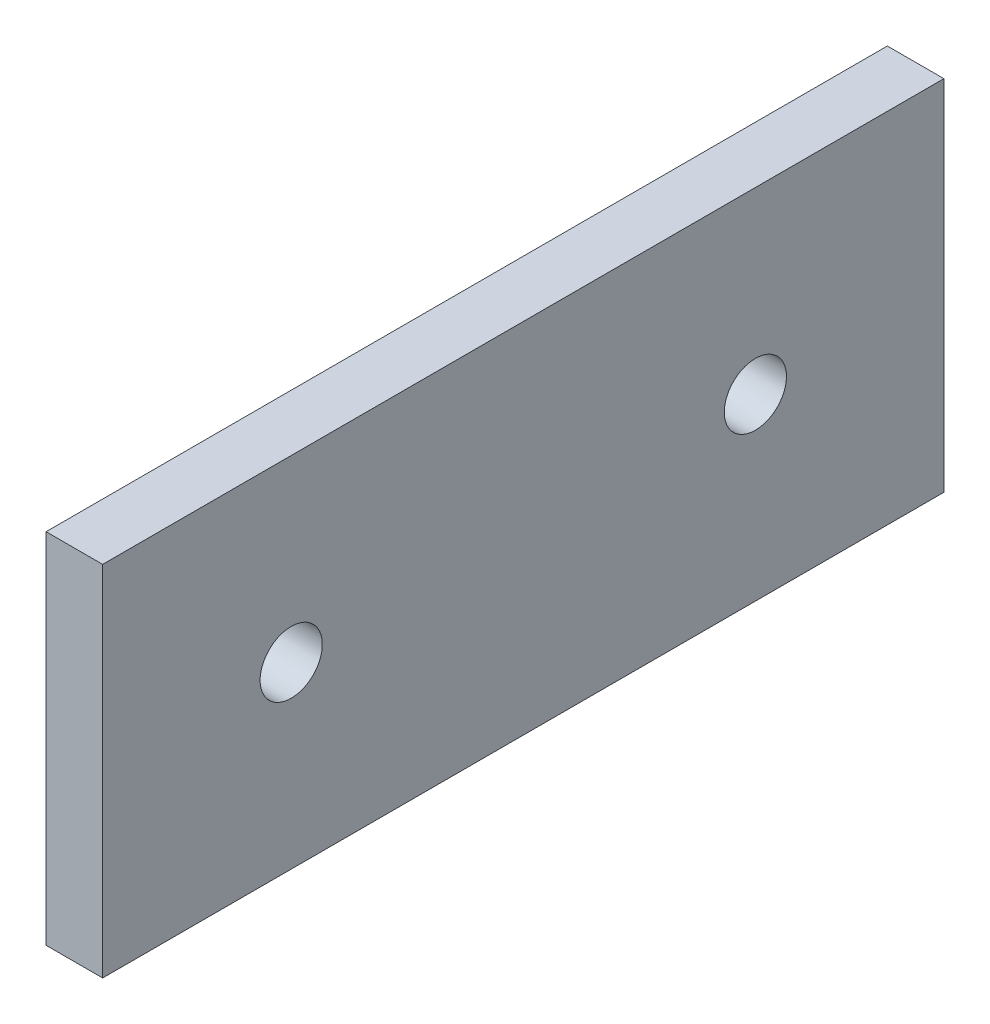
ISO-10303-21;
HEADER;
FILE_DESCRIPTION(('STEP AP214'),'2;1');
FILE_NAME('part.step','',(''),(''),'','','');
FILE_SCHEMA(('AUTOMOTIVE_DESIGN { 1 0 10303 214 1 1 1 1 }'));
ENDSEC;
DATA;
#1=APPLICATION_CONTEXT('core data for automotive mechanical design processes');
#2=APPLICATION_PROTOCOL_DEFINITION('international standard','automotive_design',2000,#1);
#3=PRODUCT_CONTEXT('',#1,'mechanical');
#4=PRODUCT('Part','Part','',(#3));
#5=PRODUCT_RELATED_PRODUCT_CATEGORY('part','',(#4));
#6=PRODUCT_DEFINITION_FORMATION('','',#4);
#7=PRODUCT_DEFINITION_CONTEXT('part definition',#1,'design');
#8=PRODUCT_DEFINITION('design','',#6,#7);
#9=PRODUCT_DEFINITION_SHAPE('','',#8);
#10=(LENGTH_UNIT() NAMED_UNIT(*) SI_UNIT(.MILLI.,.METRE.));
#11=(NAMED_UNIT(*) PLANE_ANGLE_UNIT() SI_UNIT($,.RADIAN.));
#12=(NAMED_UNIT(*) SI_UNIT($,.STERADIAN.) SOLID_ANGLE_UNIT());
#13=UNCERTAINTY_MEASURE_WITH_UNIT(LENGTH_MEASURE(1.E-05),#10,'distance_accuracy_value','');
#14=(GEOMETRIC_REPRESENTATION_CONTEXT(3) GLOBAL_UNCERTAINTY_ASSIGNED_CONTEXT((#13)) GLOBAL_UNIT_ASSIGNED_CONTEXT((#10,
#11,#12)) REPRESENTATION_CONTEXT('',''));
#15=CARTESIAN_POINT('',(0.,0.,0.));
#16=DIRECTION('',(0.,0.,1.));
#17=DIRECTION('',(1.,0.,0.));
#18=AXIS2_PLACEMENT_3D('',#15,#16,#17);
#19=CARTESIAN_POINT('',(0.,0.,44.62));
#20=DIRECTION('',(0.,0.,1.));
#21=DIRECTION('',(1.,0.,0.));
#22=AXIS2_PLACEMENT_3D('',#19,#20,#21);
#23=PLANE('',#22);
#24=DIRECTION('',(1.,0.,0.));
#25=VECTOR('',#24,1.);
#26=CARTESIAN_POINT('',(0.,-3.,44.62));
#27=LINE('',#26,#25);
#28=CARTESIAN_POINT('',(-3.,-3.,44.62));
#29=VERTEX_POINT('',#28);
#30=CARTESIAN_POINT('',(0.,-3.,44.62));
#31=VERTEX_POINT('',#30);
#32=EDGE_CURVE('E114',#29,#31,#27,.T.);
#33=ORIENTED_EDGE('',*,*,#32,.T.);
#34=DIRECTION('',(0.,-1.,0.));
#35=VECTOR('',#34,1.);
#36=CARTESIAN_POINT('',(0.,0.,44.62));
#37=LINE('',#36,#35);
#38=CARTESIAN_POINT('',(0.,16.,44.62));
#39=VERTEX_POINT('',#38);
#40=EDGE_CURVE('E94',#39,#31,#37,.T.);
#41=ORIENTED_EDGE('',*,*,#40,.F.);
#42=DIRECTION('',(-1.,0.,0.));
#43=VECTOR('',#42,1.);
#44=CARTESIAN_POINT('',(0.,16.,44.62));
#45=LINE('',#44,#43);
#46=CARTESIAN_POINT('',(-3.,16.,44.62));
#47=VERTEX_POINT('',#46);
#48=EDGE_CURVE('E77',#39,#47,#45,.T.);
#49=ORIENTED_EDGE('',*,*,#48,.T.);
#50=DIRECTION('',(0.,-1.,0.));
#51=VECTOR('',#50,1.);
#52=CARTESIAN_POINT('',(-3.,0.,44.62));
#53=LINE('',#52,#51);
#54=EDGE_CURVE('E117',#47,#29,#53,.T.);
#55=ORIENTED_EDGE('',*,*,#54,.T.);
#56=EDGE_LOOP('',(#33,#41,#49,#55));
#57=FACE_BOUND('',#56,.T.);
#58=ADVANCED_FACE('F60',(#57),#23,.T.);
#59=CARTESIAN_POINT('',(0.,0.,0.));
#60=DIRECTION('',(0.,0.,1.));
#61=DIRECTION('',(1.,0.,0.));
#62=AXIS2_PLACEMENT_3D('',#59,#60,#61);
#63=PLANE('',#62);
#64=DIRECTION('',(0.,-1.,0.));
#65=VECTOR('',#64,1.);
#66=CARTESIAN_POINT('',(0.,0.,0.));
#67=LINE('',#66,#65);
#68=CARTESIAN_POINT('',(0.,16.,0.));
#69=VERTEX_POINT('',#68);
#70=CARTESIAN_POINT('',(0.,-3.,0.));
#71=VERTEX_POINT('',#70);
#72=EDGE_CURVE('E110',#69,#71,#67,.T.);
#73=ORIENTED_EDGE('',*,*,#72,.T.);
#74=DIRECTION('',(1.,0.,0.));
#75=VECTOR('',#74,1.);
#76=CARTESIAN_POINT('',(0.,-3.,0.));
#77=LINE('',#76,#75);
#78=CARTESIAN_POINT('',(-3.,-3.,0.));
#79=VERTEX_POINT('',#78);
#80=EDGE_CURVE('E89',#79,#71,#77,.T.);
#81=ORIENTED_EDGE('',*,*,#80,.F.);
#82=DIRECTION('',(0.,-1.,0.));
#83=VECTOR('',#82,1.);
#84=CARTESIAN_POINT('',(-3.,0.,0.));
#85=LINE('',#84,#83);
#86=CARTESIAN_POINT('',(-3.,16.,0.));
#87=VERTEX_POINT('',#86);
#88=EDGE_CURVE('E109',#87,#79,#85,.T.);
#89=ORIENTED_EDGE('',*,*,#88,.F.);
#90=DIRECTION('',(-1.,0.,0.));
#91=VECTOR('',#90,1.);
#92=CARTESIAN_POINT('',(0.,16.,0.));
#93=LINE('',#92,#91);
#94=EDGE_CURVE('E121',#69,#87,#93,.T.);
#95=ORIENTED_EDGE('',*,*,#94,.F.);
#96=EDGE_LOOP('',(#73,#81,#89,#95));
#97=FACE_BOUND('',#96,.T.);
#98=ADVANCED_FACE('F132',(#97),#63,.F.);
#99=CARTESIAN_POINT('',(0.,-3.,44.62));
#100=DIRECTION('',(0.,1.,0.));
#101=DIRECTION('',(0.,0.,1.));
#102=AXIS2_PLACEMENT_3D('',#99,#100,#101);
#103=PLANE('',#102);
#104=DIRECTION('',(0.,0.,-1.));
#105=VECTOR('',#104,1.);
#106=CARTESIAN_POINT('',(0.,-3.,44.62));
#107=LINE('',#106,#105);
#108=EDGE_CURVE('E106',#31,#71,#107,.T.);
#109=ORIENTED_EDGE('',*,*,#108,.F.);
#110=ORIENTED_EDGE('',*,*,#32,.F.);
#111=DIRECTION('',(0.,0.,-1.));
#112=VECTOR('',#111,1.);
#113=CARTESIAN_POINT('',(-3.,-3.,44.62));
#114=LINE('',#113,#112);
#115=EDGE_CURVE('E12',#29,#79,#114,.T.);
#116=ORIENTED_EDGE('',*,*,#115,.T.);
#117=ORIENTED_EDGE('',*,*,#80,.T.);
#118=EDGE_LOOP('',(#109,#110,#116,#117));
#119=FACE_BOUND('',#118,.T.);
#120=ADVANCED_FACE('F113',(#119),#103,.F.);
#121=CARTESIAN_POINT('',(0.,16.,44.62));
#122=DIRECTION('',(0.,-1.,0.));
#123=DIRECTION('',(0.,0.,-1.));
#124=AXIS2_PLACEMENT_3D('',#121,#122,#123);
#125=PLANE('',#124);
#126=DIRECTION('',(0.,0.,1.));
#127=VECTOR('',#126,1.);
#128=CARTESIAN_POINT('',(0.,16.,44.62));
#129=LINE('',#128,#127);
#130=EDGE_CURVE('E108',#69,#39,#129,.T.);
#131=ORIENTED_EDGE('',*,*,#130,.F.);
#132=ORIENTED_EDGE('',*,*,#94,.T.);
#133=DIRECTION('',(0.,0.,-1.));
#134=VECTOR('',#133,1.);
#135=CARTESIAN_POINT('',(-3.,16.,44.62));
#136=LINE('',#135,#134);
#137=EDGE_CURVE('E69',#47,#87,#136,.T.);
#138=ORIENTED_EDGE('',*,*,#137,.F.);
#139=ORIENTED_EDGE('',*,*,#48,.F.);
#140=EDGE_LOOP('',(#131,#132,#138,#139));
#141=FACE_BOUND('',#140,.T.);
#142=ADVANCED_FACE('F133',(#141),#125,.F.);
#143=CARTESIAN_POINT('',(-3.,0.,44.62));
#144=DIRECTION('',(1.,0.,0.));
#145=DIRECTION('',(0.,0.,-1.));
#146=AXIS2_PLACEMENT_3D('',#143,#144,#145);
#147=PLANE('',#146);
#148=CARTESIAN_POINT('',(-3.,6.5,10.));
#149=DIRECTION('',(-1.,0.,0.));
#150=DIRECTION('',(0.,0.,1.));
#151=AXIS2_PLACEMENT_3D('',#148,#149,#150);
#152=CIRCLE('',#151,1.65);
#153=CARTESIAN_POINT('',(-3.,6.5,11.65));
#154=VERTEX_POINT('',#153);
#155=EDGE_CURVE('E137',#154,#154,#152,.T.);
#156=ORIENTED_EDGE('',*,*,#155,.F.);
#157=EDGE_LOOP('',(#156));
#158=FACE_BOUND('',#157,.T.);
#159=CARTESIAN_POINT('',(-3.,6.5,34.62));
#160=DIRECTION('',(-1.,0.,0.));
#161=DIRECTION('',(0.,0.,1.));
#162=AXIS2_PLACEMENT_3D('',#159,#160,#161);
#163=CIRCLE('',#162,1.64999999999999);
#164=CARTESIAN_POINT('',(-3.,6.5,36.27));
#165=VERTEX_POINT('',#164);
#166=EDGE_CURVE('E134',#165,#165,#163,.T.);
#167=ORIENTED_EDGE('',*,*,#166,.F.);
#168=EDGE_LOOP('',(#167));
#169=FACE_BOUND('',#168,.T.);
#170=ORIENTED_EDGE('',*,*,#88,.T.);
#171=ORIENTED_EDGE('',*,*,#115,.F.);
#172=ORIENTED_EDGE('',*,*,#54,.F.);
#173=ORIENTED_EDGE('',*,*,#137,.T.);
#174=EDGE_LOOP('',(#170,#171,#172,#173));
#175=FACE_BOUND('',#174,.T.);
#176=ADVANCED_FACE('F62',(#158,#169,#175),#147,.F.);
#177=CARTESIAN_POINT('',(0.,0.,44.62));
#178=DIRECTION('',(1.,0.,0.));
#179=DIRECTION('',(0.,0.,-1.));
#180=AXIS2_PLACEMENT_3D('',#177,#178,#179);
#181=PLANE('',#180);
#182=CARTESIAN_POINT('',(0.,6.5,10.));
#183=DIRECTION('',(1.,0.,0.));
#184=DIRECTION('',(0.,0.,-1.));
#185=AXIS2_PLACEMENT_3D('',#182,#183,#184);
#186=CIRCLE('',#185,1.65);
#187=CARTESIAN_POINT('',(0.,6.5,11.65));
#188=VERTEX_POINT('',#187);
#189=EDGE_CURVE('E145',#188,#188,#186,.T.);
#190=ORIENTED_EDGE('',*,*,#189,.F.);
#191=EDGE_LOOP('',(#190));
#192=FACE_BOUND('',#191,.T.);
#193=CARTESIAN_POINT('',(0.,6.5,34.62));
#194=DIRECTION('',(1.,0.,0.));
#195=DIRECTION('',(0.,0.,-1.));
#196=AXIS2_PLACEMENT_3D('',#193,#194,#195);
#197=CIRCLE('',#196,1.64999999999999);
#198=CARTESIAN_POINT('',(0.,6.5,36.27));
#199=VERTEX_POINT('',#198);
#200=EDGE_CURVE('E141',#199,#199,#197,.T.);
#201=ORIENTED_EDGE('',*,*,#200,.F.);
#202=EDGE_LOOP('',(#201));
#203=FACE_BOUND('',#202,.T.);
#204=ORIENTED_EDGE('',*,*,#72,.F.);
#205=ORIENTED_EDGE('',*,*,#130,.T.);
#206=ORIENTED_EDGE('',*,*,#40,.T.);
#207=ORIENTED_EDGE('',*,*,#108,.T.);
#208=EDGE_LOOP('',(#204,#205,#206,#207));
#209=FACE_BOUND('',#208,.T.);
#210=ADVANCED_FACE('F105',(#192,#203,#209),#181,.T.);
#211=CARTESIAN_POINT('',(27.,6.5,34.62));
#212=DIRECTION('',(-1.,0.,0.));
#213=DIRECTION('',(0.,0.,1.));
#214=AXIS2_PLACEMENT_3D('',#211,#212,#213);
#215=CYLINDRICAL_SURFACE('',#214,1.64999999999999);
#216=CARTESIAN_POINT('',(0.,6.5,36.27));
#217=CARTESIAN_POINT('',(-0.0312500000000035,6.5,36.27));
#218=CARTESIAN_POINT('',(-0.0625000000000035,6.5,36.27));
#219=CARTESIAN_POINT('',(-0.125000000000004,6.5,36.27));
#220=CARTESIAN_POINT('',(-0.156250000000004,6.5,36.27));
#221=CARTESIAN_POINT('',(-0.218750000000004,6.5,36.27));
#222=CARTESIAN_POINT('',(-0.250000000000004,6.5,36.27));
#223=CARTESIAN_POINT('',(-0.312500000000004,6.5,36.27));
#224=CARTESIAN_POINT('',(-0.343750000000004,6.5,36.27));
#225=CARTESIAN_POINT('',(-0.406250000000004,6.5,36.27));
#226=CARTESIAN_POINT('',(-0.437500000000004,6.5,36.27));
#227=CARTESIAN_POINT('',(-0.500000000000004,6.5,36.27));
#228=CARTESIAN_POINT('',(-0.531250000000004,6.5,36.27));
#229=CARTESIAN_POINT('',(-0.593750000000004,6.5,36.27));
#230=CARTESIAN_POINT('',(-0.625000000000004,6.5,36.27));
#231=CARTESIAN_POINT('',(-0.687500000000004,6.5,36.27));
#232=CARTESIAN_POINT('',(-0.718750000000004,6.5,36.27));
#233=CARTESIAN_POINT('',(-0.781250000000003,6.5,36.27));
#234=CARTESIAN_POINT('',(-0.812500000000002,6.5,36.27));
#235=CARTESIAN_POINT('',(-0.875000000000001,6.5,36.27));
#236=CARTESIAN_POINT('',(-0.906250000000001,6.5,36.27));
#237=CARTESIAN_POINT('',(-0.968750000000001,6.5,36.27));
#238=CARTESIAN_POINT('',(-1.,6.5,36.27));
#239=CARTESIAN_POINT('',(-1.0625,6.5,36.27));
#240=CARTESIAN_POINT('',(-1.09375,6.5,36.27));
#241=CARTESIAN_POINT('',(-1.15625,6.5,36.27));
#242=CARTESIAN_POINT('',(-1.1875,6.5,36.27));
#243=CARTESIAN_POINT('',(-1.25,6.5,36.27));
#244=CARTESIAN_POINT('',(-1.28125,6.5,36.27));
#245=CARTESIAN_POINT('',(-1.34375,6.5,36.27));
#246=CARTESIAN_POINT('',(-1.375,6.5,36.27));
#247=CARTESIAN_POINT('',(-1.4375,6.5,36.27));
#248=CARTESIAN_POINT('',(-1.46875,6.5,36.27));
#249=CARTESIAN_POINT('',(-1.53125,6.5,36.27));
#250=CARTESIAN_POINT('',(-1.5625,6.5,36.27));
#251=CARTESIAN_POINT('',(-1.625,6.5,36.27));
#252=CARTESIAN_POINT('',(-1.65625,6.5,36.27));
#253=CARTESIAN_POINT('',(-1.71875,6.5,36.27));
#254=CARTESIAN_POINT('',(-1.75,6.5,36.27));
#255=CARTESIAN_POINT('',(-1.8125,6.5,36.27));
#256=CARTESIAN_POINT('',(-1.84375,6.5,36.27));
#257=CARTESIAN_POINT('',(-1.90625,6.5,36.27));
#258=CARTESIAN_POINT('',(-1.9375,6.5,36.27));
#259=CARTESIAN_POINT('',(-2.,6.5,36.27));
#260=CARTESIAN_POINT('',(-2.03125,6.5,36.27));
#261=CARTESIAN_POINT('',(-2.09375,6.5,36.27));
#262=CARTESIAN_POINT('',(-2.125,6.5,36.27));
#263=CARTESIAN_POINT('',(-2.1875,6.5,36.27));
#264=CARTESIAN_POINT('',(-2.21875,6.5,36.27));
#265=CARTESIAN_POINT('',(-2.28125,6.5,36.27));
#266=CARTESIAN_POINT('',(-2.3125,6.5,36.27));
#267=CARTESIAN_POINT('',(-2.375,6.5,36.27));
#268=CARTESIAN_POINT('',(-2.40625,6.5,36.27));
#269=CARTESIAN_POINT('',(-2.46875,6.5,36.27));
#270=CARTESIAN_POINT('',(-2.5,6.5,36.27));
#271=CARTESIAN_POINT('',(-2.5625,6.5,36.27));
#272=CARTESIAN_POINT('',(-2.59375,6.5,36.27));
#273=CARTESIAN_POINT('',(-2.65625,6.5,36.27));
#274=CARTESIAN_POINT('',(-2.6875,6.5,36.27));
#275=CARTESIAN_POINT('',(-2.75,6.5,36.27));
#276=CARTESIAN_POINT('',(-2.78125,6.5,36.27));
#277=CARTESIAN_POINT('',(-2.84375,6.5,36.27));
#278=CARTESIAN_POINT('',(-2.875,6.5,36.27));
#279=CARTESIAN_POINT('',(-2.9375,6.5,36.27));
#280=CARTESIAN_POINT('',(-2.96875,6.5,36.27));
#281=CARTESIAN_POINT('',(-3.,6.5,36.27));
#282=B_SPLINE_CURVE_WITH_KNOTS('',3,(#216,#217,#218,#219,#220,#221,#222,#223,#224,#225,#226,
#227,#228,#229,#230,#231,#232,#233,#234,#235,#236,#237,#238,#239,#240,#241,#242,#243,#244,#245,
#246,#247,#248,#249,#250,#251,#252,#253,#254,#255,#256,#257,#258,#259,#260,#261,#262,#263,#264,
#265,#266,#267,#268,#269,#270,#271,#272,#273,#274,#275,#276,#277,#278,#279,#280,#281),
.UNSPECIFIED.,.F.,.F.,(4,2,2,2,2,2,2,2,2,2,2,2,2,2,2,2,2,2,2,2,2,2,2,2,2,2,2,2,2,2,2,2,4),(0.,
0.0937500000000001,0.1875,0.28125,0.375,0.46875,0.5625,0.656250000000001,0.750000000000001,
0.843749999999997,0.937499999999997,1.03125,1.125,1.21875,1.3125,1.40625,1.5,1.59375,1.6875,
1.78125,1.875,1.96875,2.0625,2.15625,2.25,2.34375,2.4375,2.53125,2.625,2.71875,2.8125,2.90625,
3.),.UNSPECIFIED.);
#283=EDGE_CURVE('BSEAM154',#199,#165,#282,.T.);
#284=ORIENTED_EDGE('',*,*,#200,.T.);
#285=ORIENTED_EDGE('',*,*,#166,.T.);
#286=ORIENTED_EDGE('',*,*,#283,.T.);
#287=ORIENTED_EDGE('',*,*,#283,.F.);
#288=EDGE_LOOP('',(#284,#286,#285,#287));
#289=FACE_BOUND('',#288,.T.);
#290=ADVANCED_FACE('F154',(#289),#215,.F.);
#291=CARTESIAN_POINT('',(27.,6.5,10.));
#292=DIRECTION('',(-1.,0.,0.));
#293=DIRECTION('',(0.,0.,1.));
#294=AXIS2_PLACEMENT_3D('',#291,#292,#293);
#295=CYLINDRICAL_SURFACE('',#294,1.65);
#296=CARTESIAN_POINT('',(0.,6.5,11.65));
#297=CARTESIAN_POINT('',(-0.0312500000000035,6.5,11.65));
#298=CARTESIAN_POINT('',(-0.0625000000000035,6.5,11.65));
#299=CARTESIAN_POINT('',(-0.125000000000004,6.5,11.65));
#300=CARTESIAN_POINT('',(-0.156250000000004,6.5,11.65));
#301=CARTESIAN_POINT('',(-0.218750000000004,6.5,11.65));
#302=CARTESIAN_POINT('',(-0.250000000000004,6.5,11.65));
#303=CARTESIAN_POINT('',(-0.312500000000004,6.5,11.65));
#304=CARTESIAN_POINT('',(-0.343750000000004,6.5,11.65));
#305=CARTESIAN_POINT('',(-0.406250000000004,6.5,11.65));
#306=CARTESIAN_POINT('',(-0.437500000000004,6.5,11.65));
#307=CARTESIAN_POINT('',(-0.500000000000004,6.5,11.65));
#308=CARTESIAN_POINT('',(-0.531250000000004,6.5,11.65));
#309=CARTESIAN_POINT('',(-0.593750000000004,6.5,11.65));
#310=CARTESIAN_POINT('',(-0.625000000000004,6.5,11.65));
#311=CARTESIAN_POINT('',(-0.687500000000004,6.5,11.65));
#312=CARTESIAN_POINT('',(-0.718750000000004,6.5,11.65));
#313=CARTESIAN_POINT('',(-0.781250000000003,6.5,11.65));
#314=CARTESIAN_POINT('',(-0.812500000000002,6.5,11.65));
#315=CARTESIAN_POINT('',(-0.875000000000001,6.5,11.65));
#316=CARTESIAN_POINT('',(-0.906250000000001,6.5,11.65));
#317=CARTESIAN_POINT('',(-0.968750000000001,6.5,11.65));
#318=CARTESIAN_POINT('',(-1.,6.5,11.65));
#319=CARTESIAN_POINT('',(-1.0625,6.5,11.65));
#320=CARTESIAN_POINT('',(-1.09375,6.5,11.65));
#321=CARTESIAN_POINT('',(-1.15625,6.5,11.65));
#322=CARTESIAN_POINT('',(-1.1875,6.5,11.65));
#323=CARTESIAN_POINT('',(-1.25,6.5,11.65));
#324=CARTESIAN_POINT('',(-1.28125,6.5,11.65));
#325=CARTESIAN_POINT('',(-1.34375,6.5,11.65));
#326=CARTESIAN_POINT('',(-1.375,6.5,11.65));
#327=CARTESIAN_POINT('',(-1.4375,6.5,11.65));
#328=CARTESIAN_POINT('',(-1.46875,6.5,11.65));
#329=CARTESIAN_POINT('',(-1.53125,6.5,11.65));
#330=CARTESIAN_POINT('',(-1.5625,6.5,11.65));
#331=CARTESIAN_POINT('',(-1.625,6.5,11.65));
#332=CARTESIAN_POINT('',(-1.65625,6.5,11.65));
#333=CARTESIAN_POINT('',(-1.71875,6.5,11.65));
#334=CARTESIAN_POINT('',(-1.75,6.5,11.65));
#335=CARTESIAN_POINT('',(-1.8125,6.5,11.65));
#336=CARTESIAN_POINT('',(-1.84375,6.5,11.65));
#337=CARTESIAN_POINT('',(-1.90625,6.5,11.65));
#338=CARTESIAN_POINT('',(-1.9375,6.5,11.65));
#339=CARTESIAN_POINT('',(-2.,6.5,11.65));
#340=CARTESIAN_POINT('',(-2.03125,6.5,11.65));
#341=CARTESIAN_POINT('',(-2.09375,6.5,11.65));
#342=CARTESIAN_POINT('',(-2.125,6.5,11.65));
#343=CARTESIAN_POINT('',(-2.1875,6.5,11.65));
#344=CARTESIAN_POINT('',(-2.21875,6.5,11.65));
#345=CARTESIAN_POINT('',(-2.28125,6.5,11.65));
#346=CARTESIAN_POINT('',(-2.3125,6.5,11.65));
#347=CARTESIAN_POINT('',(-2.375,6.5,11.65));
#348=CARTESIAN_POINT('',(-2.40625,6.5,11.65));
#349=CARTESIAN_POINT('',(-2.46875,6.5,11.65));
#350=CARTESIAN_POINT('',(-2.5,6.5,11.65));
#351=CARTESIAN_POINT('',(-2.5625,6.5,11.65));
#352=CARTESIAN_POINT('',(-2.59375,6.5,11.65));
#353=CARTESIAN_POINT('',(-2.65625,6.5,11.65));
#354=CARTESIAN_POINT('',(-2.6875,6.5,11.65));
#355=CARTESIAN_POINT('',(-2.75,6.5,11.65));
#356=CARTESIAN_POINT('',(-2.78125,6.5,11.65));
#357=CARTESIAN_POINT('',(-2.84375,6.5,11.65));
#358=CARTESIAN_POINT('',(-2.875,6.5,11.65));
#359=CARTESIAN_POINT('',(-2.9375,6.5,11.65));
#360=CARTESIAN_POINT('',(-2.96875,6.5,11.65));
#361=CARTESIAN_POINT('',(-3.,6.5,11.65));
#362=B_SPLINE_CURVE_WITH_KNOTS('',3,(#296,#297,#298,#299,#300,#301,#302,#303,#304,#305,#306,
#307,#308,#309,#310,#311,#312,#313,#314,#315,#316,#317,#318,#319,#320,#321,#322,#323,#324,#325,
#326,#327,#328,#329,#330,#331,#332,#333,#334,#335,#336,#337,#338,#339,#340,#341,#342,#343,#344,
#345,#346,#347,#348,#349,#350,#351,#352,#353,#354,#355,#356,#357,#358,#359,#360,#361),
.UNSPECIFIED.,.F.,.F.,(4,2,2,2,2,2,2,2,2,2,2,2,2,2,2,2,2,2,2,2,2,2,2,2,2,2,2,2,2,2,2,2,4),(0.,
0.0937500000000001,0.1875,0.28125,0.375,0.46875,0.5625,0.656250000000001,0.750000000000001,
0.843749999999997,0.937499999999997,1.03125,1.125,1.21875,1.3125,1.40625,1.5,1.59375,1.6875,
1.78125,1.875,1.96875,2.0625,2.15625,2.25,2.34375,2.4375,2.53125,2.625,2.71875,2.8125,2.90625,
3.),.UNSPECIFIED.);
#363=EDGE_CURVE('BSEAM149',#188,#154,#362,.T.);
#364=ORIENTED_EDGE('',*,*,#189,.T.);
#365=ORIENTED_EDGE('',*,*,#155,.T.);
#366=ORIENTED_EDGE('',*,*,#363,.T.);
#367=ORIENTED_EDGE('',*,*,#363,.F.);
#368=EDGE_LOOP('',(#364,#366,#365,#367));
#369=FACE_BOUND('',#368,.T.);
#370=ADVANCED_FACE('F149',(#369),#295,.F.);
#371=CLOSED_SHELL('',(#58,#98,#120,#142,#176,#210,#290,#370));
#372=MANIFOLD_SOLID_BREP('B2',#371);
#373=ADVANCED_BREP_SHAPE_REPRESENTATION('',(#18,#372),#14);
#374=SHAPE_DEFINITION_REPRESENTATION(#9,#373);
ENDSEC;
END-ISO-10303-21;
